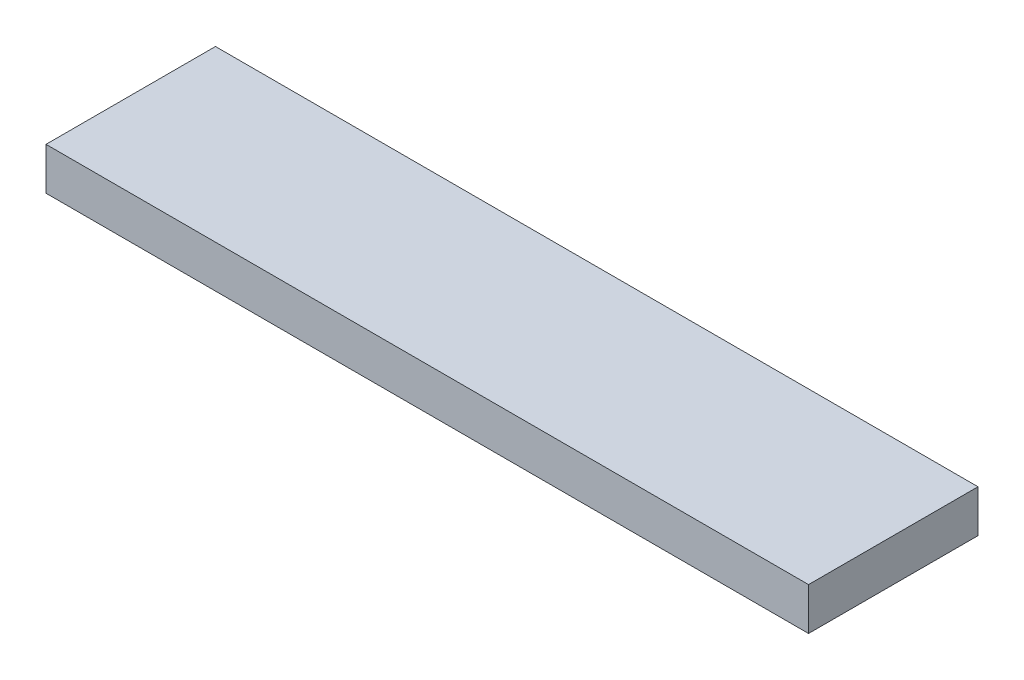
ISO-10303-21;
HEADER;
FILE_DESCRIPTION(('STEP AP214'),'2;1');
FILE_NAME('part.step','',(''),(''),'','','');
FILE_SCHEMA(('AUTOMOTIVE_DESIGN { 1 0 10303 214 1 1 1 1 }'));
ENDSEC;
DATA;
#1=APPLICATION_CONTEXT('core data for automotive mechanical design processes');
#2=APPLICATION_PROTOCOL_DEFINITION('international standard','automotive_design',2000,#1);
#3=PRODUCT_CONTEXT('',#1,'mechanical');
#4=PRODUCT('Part','Part','',(#3));
#5=PRODUCT_RELATED_PRODUCT_CATEGORY('part','',(#4));
#6=PRODUCT_DEFINITION_FORMATION('','',#4);
#7=PRODUCT_DEFINITION_CONTEXT('part definition',#1,'design');
#8=PRODUCT_DEFINITION('design','',#6,#7);
#9=PRODUCT_DEFINITION_SHAPE('','',#8);
#10=(LENGTH_UNIT() NAMED_UNIT(*) SI_UNIT(.MILLI.,.METRE.));
#11=(NAMED_UNIT(*) PLANE_ANGLE_UNIT() SI_UNIT($,.RADIAN.));
#12=(NAMED_UNIT(*) SI_UNIT($,.STERADIAN.) SOLID_ANGLE_UNIT());
#13=UNCERTAINTY_MEASURE_WITH_UNIT(LENGTH_MEASURE(1.E-05),#10,'distance_accuracy_value','');
#14=(GEOMETRIC_REPRESENTATION_CONTEXT(3) GLOBAL_UNCERTAINTY_ASSIGNED_CONTEXT((#13)) GLOBAL_UNIT_ASSIGNED_CONTEXT((#10,
#11,#12)) REPRESENTATION_CONTEXT('',''));
#15=CARTESIAN_POINT('',(0.,0.,0.));
#16=DIRECTION('',(0.,0.,1.));
#17=DIRECTION('',(1.,0.,0.));
#18=AXIS2_PLACEMENT_3D('',#15,#16,#17);
#19=CARTESIAN_POINT('',(114.3,-6.34999999999999,50.8));
#20=DIRECTION('',(-1.,0.,0.));
#21=DIRECTION('',(0.,0.,1.));
#22=AXIS2_PLACEMENT_3D('',#19,#20,#21);
#23=PLANE('',#22);
#24=DIRECTION('',(0.,1.,0.));
#25=VECTOR('',#24,1.);
#26=CARTESIAN_POINT('',(114.3,-6.34999999999999,0.));
#27=LINE('',#26,#25);
#28=CARTESIAN_POINT('',(114.3,-6.34999999999999,0.));
#29=VERTEX_POINT('',#28);
#30=CARTESIAN_POINT('',(114.3,6.35000000000001,0.));
#31=VERTEX_POINT('',#30);
#32=EDGE_CURVE('E96',#29,#31,#27,.T.);
#33=ORIENTED_EDGE('',*,*,#32,.T.);
#34=DIRECTION('',(0.,0.,-1.));
#35=VECTOR('',#34,1.);
#36=CARTESIAN_POINT('',(114.3,6.35000000000001,50.8));
#37=LINE('',#36,#35);
#38=CARTESIAN_POINT('',(114.3,6.35000000000001,50.8));
#39=VERTEX_POINT('',#38);
#40=EDGE_CURVE('E11',#39,#31,#37,.T.);
#41=ORIENTED_EDGE('',*,*,#40,.F.);
#42=DIRECTION('',(0.,1.,0.));
#43=VECTOR('',#42,1.);
#44=CARTESIAN_POINT('',(114.3,-6.34999999999999,50.8));
#45=LINE('',#44,#43);
#46=CARTESIAN_POINT('',(114.3,-6.34999999999999,50.8));
#47=VERTEX_POINT('',#46);
#48=EDGE_CURVE('E84',#47,#39,#45,.T.);
#49=ORIENTED_EDGE('',*,*,#48,.F.);
#50=DIRECTION('',(0.,0.,-1.));
#51=VECTOR('',#50,1.);
#52=CARTESIAN_POINT('',(114.3,-6.34999999999999,50.8));
#53=LINE('',#52,#51);
#54=EDGE_CURVE('E92',#47,#29,#53,.T.);
#55=ORIENTED_EDGE('',*,*,#54,.T.);
#56=EDGE_LOOP('',(#33,#41,#49,#55));
#57=FACE_BOUND('',#56,.T.);
#58=ADVANCED_FACE('F33',(#57),#23,.F.);
#59=CARTESIAN_POINT('',(-114.3,6.35000000000001,50.8));
#60=DIRECTION('',(0.,-1.,0.));
#61=DIRECTION('',(0.,0.,-1.));
#62=AXIS2_PLACEMENT_3D('',#59,#60,#61);
#63=PLANE('',#62);
#64=DIRECTION('',(-1.,0.,0.));
#65=VECTOR('',#64,1.);
#66=CARTESIAN_POINT('',(-114.3,6.35000000000001,0.));
#67=LINE('',#66,#65);
#68=CARTESIAN_POINT('',(-114.3,6.35000000000001,0.));
#69=VERTEX_POINT('',#68);
#70=EDGE_CURVE('E88',#31,#69,#67,.T.);
#71=ORIENTED_EDGE('',*,*,#70,.T.);
#72=DIRECTION('',(0.,0.,-1.));
#73=VECTOR('',#72,1.);
#74=CARTESIAN_POINT('',(-114.3,6.35000000000001,50.8));
#75=LINE('',#74,#73);
#76=CARTESIAN_POINT('',(-114.3,6.35000000000001,50.8));
#77=VERTEX_POINT('',#76);
#78=EDGE_CURVE('E41',#77,#69,#75,.T.);
#79=ORIENTED_EDGE('',*,*,#78,.F.);
#80=DIRECTION('',(-1.,0.,0.));
#81=VECTOR('',#80,1.);
#82=CARTESIAN_POINT('',(-114.3,6.35000000000001,50.8));
#83=LINE('',#82,#81);
#84=EDGE_CURVE('E79',#39,#77,#83,.T.);
#85=ORIENTED_EDGE('',*,*,#84,.F.);
#86=ORIENTED_EDGE('',*,*,#40,.T.);
#87=EDGE_LOOP('',(#71,#79,#85,#86));
#88=FACE_BOUND('',#87,.T.);
#89=ADVANCED_FACE('F87',(#88),#63,.F.);
#90=CARTESIAN_POINT('',(-114.3,-6.34999999999999,50.8));
#91=DIRECTION('',(1.,0.,0.));
#92=DIRECTION('',(0.,0.,-1.));
#93=AXIS2_PLACEMENT_3D('',#90,#91,#92);
#94=PLANE('',#93);
#95=DIRECTION('',(0.,-1.,0.));
#96=VECTOR('',#95,1.);
#97=CARTESIAN_POINT('',(-114.3,-6.34999999999999,0.));
#98=LINE('',#97,#96);
#99=CARTESIAN_POINT('',(-114.3,-6.34999999999999,0.));
#100=VERTEX_POINT('',#99);
#101=EDGE_CURVE('E66',#69,#100,#98,.T.);
#102=ORIENTED_EDGE('',*,*,#101,.T.);
#103=DIRECTION('',(0.,0.,-1.));
#104=VECTOR('',#103,1.);
#105=CARTESIAN_POINT('',(-114.3,-6.34999999999999,50.8));
#106=LINE('',#105,#104);
#107=CARTESIAN_POINT('',(-114.3,-6.34999999999999,50.8));
#108=VERTEX_POINT('',#107);
#109=EDGE_CURVE('E89',#108,#100,#106,.T.);
#110=ORIENTED_EDGE('',*,*,#109,.F.);
#111=DIRECTION('',(0.,-1.,0.));
#112=VECTOR('',#111,1.);
#113=CARTESIAN_POINT('',(-114.3,-6.34999999999999,50.8));
#114=LINE('',#113,#112);
#115=EDGE_CURVE('E82',#77,#108,#114,.T.);
#116=ORIENTED_EDGE('',*,*,#115,.F.);
#117=ORIENTED_EDGE('',*,*,#78,.T.);
#118=EDGE_LOOP('',(#102,#110,#116,#117));
#119=FACE_BOUND('',#118,.T.);
#120=ADVANCED_FACE('F90',(#119),#94,.F.);
#121=CARTESIAN_POINT('',(-114.3,-6.34999999999999,50.8));
#122=DIRECTION('',(0.,1.,0.));
#123=DIRECTION('',(0.,0.,1.));
#124=AXIS2_PLACEMENT_3D('',#121,#122,#123);
#125=PLANE('',#124);
#126=DIRECTION('',(1.,0.,0.));
#127=VECTOR('',#126,1.);
#128=CARTESIAN_POINT('',(-114.3,-6.34999999999999,0.));
#129=LINE('',#128,#127);
#130=EDGE_CURVE('E72',#100,#29,#129,.T.);
#131=ORIENTED_EDGE('',*,*,#130,.T.);
#132=ORIENTED_EDGE('',*,*,#54,.F.);
#133=DIRECTION('',(1.,0.,0.));
#134=VECTOR('',#133,1.);
#135=CARTESIAN_POINT('',(-114.3,-6.34999999999999,50.8));
#136=LINE('',#135,#134);
#137=EDGE_CURVE('E49',#108,#47,#136,.T.);
#138=ORIENTED_EDGE('',*,*,#137,.F.);
#139=ORIENTED_EDGE('',*,*,#109,.T.);
#140=EDGE_LOOP('',(#131,#132,#138,#139));
#141=FACE_BOUND('',#140,.T.);
#142=ADVANCED_FACE('F103',(#141),#125,.F.);
#143=CARTESIAN_POINT('',(0.,0.,50.8));
#144=DIRECTION('',(0.,0.,-1.));
#145=DIRECTION('',(-1.,0.,0.));
#146=AXIS2_PLACEMENT_3D('',#143,#144,#145);
#147=PLANE('',#146);
#148=ORIENTED_EDGE('',*,*,#48,.T.);
#149=ORIENTED_EDGE('',*,*,#84,.T.);
#150=ORIENTED_EDGE('',*,*,#115,.T.);
#151=ORIENTED_EDGE('',*,*,#137,.T.);
#152=EDGE_LOOP('',(#148,#149,#150,#151));
#153=FACE_BOUND('',#152,.T.);
#154=ADVANCED_FACE('F80',(#153),#147,.F.);
#155=CARTESIAN_POINT('',(0.,0.,0.));
#156=DIRECTION('',(0.,0.,-1.));
#157=DIRECTION('',(-1.,0.,0.));
#158=AXIS2_PLACEMENT_3D('',#155,#156,#157);
#159=PLANE('',#158);
#160=ORIENTED_EDGE('',*,*,#32,.F.);
#161=ORIENTED_EDGE('',*,*,#130,.F.);
#162=ORIENTED_EDGE('',*,*,#101,.F.);
#163=ORIENTED_EDGE('',*,*,#70,.F.);
#164=EDGE_LOOP('',(#160,#161,#162,#163));
#165=FACE_BOUND('',#164,.T.);
#166=ADVANCED_FACE('F106',(#165),#159,.T.);
#167=CLOSED_SHELL('',(#58,#89,#120,#142,#154,#166));
#168=MANIFOLD_SOLID_BREP('B2',#167);
#169=ADVANCED_BREP_SHAPE_REPRESENTATION('',(#18,#168),#14);
#170=SHAPE_DEFINITION_REPRESENTATION(#9,#169);
ENDSEC;
END-ISO-10303-21;
